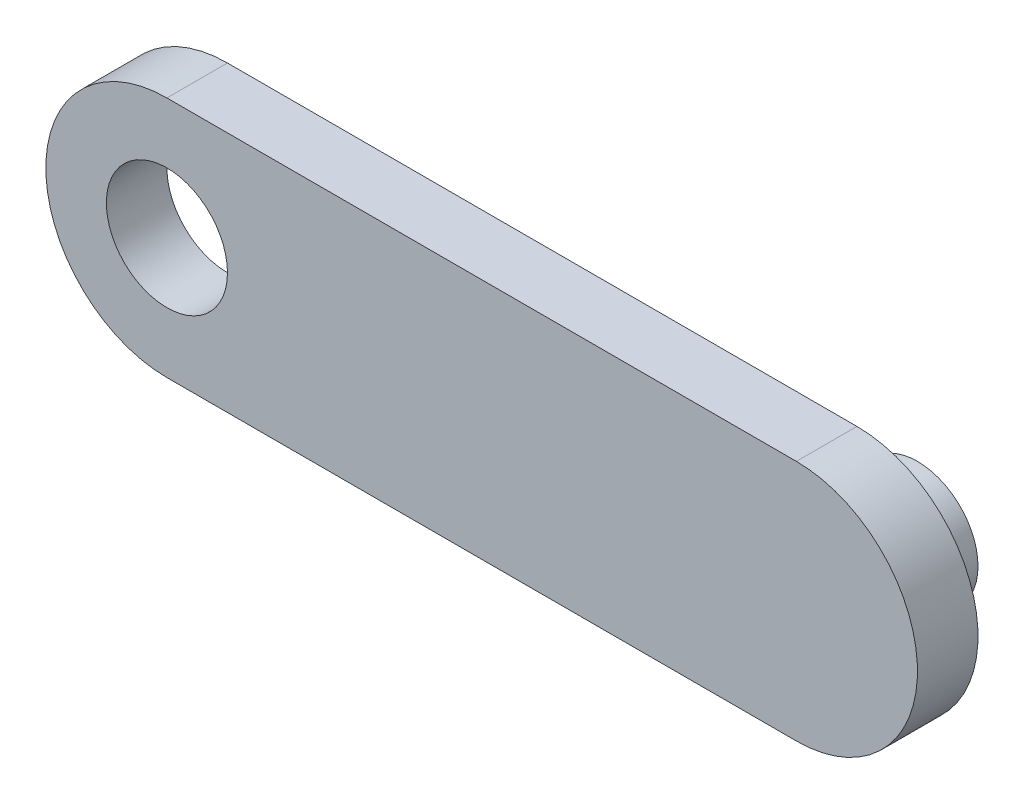
ISO-10303-21;
HEADER;
FILE_DESCRIPTION(('STEP AP214'),'2;1');
FILE_NAME('part.step','',(''),(''),'','','');
FILE_SCHEMA(('AUTOMOTIVE_DESIGN { 1 0 10303 214 1 1 1 1 }'));
ENDSEC;
DATA;
#1=APPLICATION_CONTEXT('core data for automotive mechanical design processes');
#2=APPLICATION_PROTOCOL_DEFINITION('international standard','automotive_design',2000,#1);
#3=PRODUCT_CONTEXT('',#1,'mechanical');
#4=PRODUCT('Part','Part','',(#3));
#5=PRODUCT_RELATED_PRODUCT_CATEGORY('part','',(#4));
#6=PRODUCT_DEFINITION_FORMATION('','',#4);
#7=PRODUCT_DEFINITION_CONTEXT('part definition',#1,'design');
#8=PRODUCT_DEFINITION('design','',#6,#7);
#9=PRODUCT_DEFINITION_SHAPE('','',#8);
#10=(LENGTH_UNIT() NAMED_UNIT(*) SI_UNIT(.MILLI.,.METRE.));
#11=(NAMED_UNIT(*) PLANE_ANGLE_UNIT() SI_UNIT($,.RADIAN.));
#12=(NAMED_UNIT(*) SI_UNIT($,.STERADIAN.) SOLID_ANGLE_UNIT());
#13=UNCERTAINTY_MEASURE_WITH_UNIT(LENGTH_MEASURE(1.E-05),#10,'distance_accuracy_value','');
#14=(GEOMETRIC_REPRESENTATION_CONTEXT(3) GLOBAL_UNCERTAINTY_ASSIGNED_CONTEXT((#13)) GLOBAL_UNIT_ASSIGNED_CONTEXT((#10,
#11,#12)) REPRESENTATION_CONTEXT('',''));
#15=CARTESIAN_POINT('',(0.,0.,0.));
#16=DIRECTION('',(0.,0.,1.));
#17=DIRECTION('',(1.,0.,0.));
#18=AXIS2_PLACEMENT_3D('',#15,#16,#17);
#19=CARTESIAN_POINT('',(0.,0.,10.));
#20=DIRECTION('',(0.,0.,1.));
#21=DIRECTION('',(1.,0.,0.));
#22=AXIS2_PLACEMENT_3D('',#19,#20,#21);
#23=PLANE('',#22);
#24=CARTESIAN_POINT('',(0.,0.,10.));
#25=DIRECTION('',(0.,0.,1.));
#26=DIRECTION('',(1.,0.,0.));
#27=AXIS2_PLACEMENT_3D('',#24,#25,#26);
#28=CIRCLE('',#27,20.);
#29=CARTESIAN_POINT('',(0.,20.,10.));
#30=VERTEX_POINT('',#29);
#31=CARTESIAN_POINT('',(0.,-20.,10.));
#32=VERTEX_POINT('',#31);
#33=EDGE_CURVE('E86',#30,#32,#28,.T.);
#34=ORIENTED_EDGE('',*,*,#33,.T.);
#35=DIRECTION('',(1.,0.,0.));
#36=VECTOR('',#35,1.);
#37=CARTESIAN_POINT('',(0.,-20.,10.));
#38=LINE('',#37,#36);
#39=CARTESIAN_POINT('',(103.959759811176,-20.,10.));
#40=VERTEX_POINT('',#39);
#41=EDGE_CURVE('E81',#32,#40,#38,.T.);
#42=ORIENTED_EDGE('',*,*,#41,.T.);
#43=CARTESIAN_POINT('',(103.959759811176,0.,10.));
#44=DIRECTION('',(0.,0.,1.));
#45=DIRECTION('',(1.,0.,0.));
#46=AXIS2_PLACEMENT_3D('',#43,#44,#45);
#47=CIRCLE('',#46,20.);
#48=CARTESIAN_POINT('',(103.959759811176,20.,10.));
#49=VERTEX_POINT('',#48);
#50=EDGE_CURVE('E84',#40,#49,#47,.T.);
#51=ORIENTED_EDGE('',*,*,#50,.T.);
#52=DIRECTION('',(-1.,0.,0.));
#53=VECTOR('',#52,1.);
#54=CARTESIAN_POINT('',(0.,20.,10.));
#55=LINE('',#54,#53);
#56=EDGE_CURVE('E50',#49,#30,#55,.T.);
#57=ORIENTED_EDGE('',*,*,#56,.T.);
#58=EDGE_LOOP('',(#34,#42,#51,#57));
#59=FACE_BOUND('',#58,.T.);
#60=CARTESIAN_POINT('',(0.,0.,10.));
#61=DIRECTION('',(0.,0.,1.));
#62=DIRECTION('',(1.,0.,0.));
#63=AXIS2_PLACEMENT_3D('',#60,#61,#62);
#64=CIRCLE('',#63,10.);
#65=CARTESIAN_POINT('',(10.,0.,10.));
#66=VERTEX_POINT('',#65);
#67=EDGE_CURVE('E103',#66,#66,#64,.T.);
#68=ORIENTED_EDGE('',*,*,#67,.F.);
#69=EDGE_LOOP('',(#68));
#70=FACE_BOUND('',#69,.T.);
#71=ADVANCED_FACE('F33',(#59,#70),#23,.T.);
#72=CARTESIAN_POINT('',(0.,0.,0.));
#73=DIRECTION('',(0.,0.,1.));
#74=DIRECTION('',(1.,0.,0.));
#75=AXIS2_PLACEMENT_3D('',#72,#73,#74);
#76=PLANE('',#75);
#77=CARTESIAN_POINT('',(103.959759811176,0.,0.));
#78=DIRECTION('',(0.,0.,1.));
#79=DIRECTION('',(1.,0.,0.));
#80=AXIS2_PLACEMENT_3D('',#77,#78,#79);
#81=CIRCLE('',#80,9.99999999999999);
#82=CARTESIAN_POINT('',(113.959759811176,0.,0.));
#83=VERTEX_POINT('',#82);
#84=EDGE_CURVE('E11',#83,#83,#81,.F.);
#85=ORIENTED_EDGE('',*,*,#84,.F.);
#86=EDGE_LOOP('',(#85));
#87=FACE_BOUND('',#86,.T.);
#88=CARTESIAN_POINT('',(0.,0.,0.));
#89=DIRECTION('',(0.,0.,1.));
#90=DIRECTION('',(1.,0.,0.));
#91=AXIS2_PLACEMENT_3D('',#88,#89,#90);
#92=CIRCLE('',#91,20.);
#93=CARTESIAN_POINT('',(0.,20.,0.));
#94=VERTEX_POINT('',#93);
#95=CARTESIAN_POINT('',(0.,-20.,0.));
#96=VERTEX_POINT('',#95);
#97=EDGE_CURVE('E100',#94,#96,#92,.T.);
#98=ORIENTED_EDGE('',*,*,#97,.F.);
#99=DIRECTION('',(-1.,0.,0.));
#100=VECTOR('',#99,1.);
#101=CARTESIAN_POINT('',(0.,20.,0.));
#102=LINE('',#101,#100);
#103=CARTESIAN_POINT('',(103.959759811176,20.,0.));
#104=VERTEX_POINT('',#103);
#105=EDGE_CURVE('E73',#104,#94,#102,.T.);
#106=ORIENTED_EDGE('',*,*,#105,.F.);
#107=CARTESIAN_POINT('',(103.959759811176,0.,0.));
#108=DIRECTION('',(0.,0.,1.));
#109=DIRECTION('',(1.,0.,0.));
#110=AXIS2_PLACEMENT_3D('',#107,#108,#109);
#111=CIRCLE('',#110,20.);
#112=CARTESIAN_POINT('',(103.959759811176,-20.,0.));
#113=VERTEX_POINT('',#112);
#114=EDGE_CURVE('E67',#113,#104,#111,.T.);
#115=ORIENTED_EDGE('',*,*,#114,.F.);
#116=DIRECTION('',(1.,0.,0.));
#117=VECTOR('',#116,1.);
#118=CARTESIAN_POINT('',(0.,-20.,0.));
#119=LINE('',#118,#117);
#120=EDGE_CURVE('E91',#96,#113,#119,.T.);
#121=ORIENTED_EDGE('',*,*,#120,.F.);
#122=EDGE_LOOP('',(#98,#106,#115,#121));
#123=FACE_BOUND('',#122,.T.);
#124=CARTESIAN_POINT('',(0.,0.,0.));
#125=DIRECTION('',(0.,0.,1.));
#126=DIRECTION('',(1.,0.,0.));
#127=AXIS2_PLACEMENT_3D('',#124,#125,#126);
#128=CIRCLE('',#127,10.);
#129=CARTESIAN_POINT('',(10.,0.,0.));
#130=VERTEX_POINT('',#129);
#131=EDGE_CURVE('E118',#130,#130,#128,.T.);
#132=ORIENTED_EDGE('',*,*,#131,.T.);
#133=EDGE_LOOP('',(#132));
#134=FACE_BOUND('',#133,.T.);
#135=ADVANCED_FACE('F111',(#87,#123,#134),#76,.F.);
#136=CARTESIAN_POINT('',(0.,0.,10.));
#137=DIRECTION('',(0.,0.,-1.));
#138=DIRECTION('',(-1.,0.,0.));
#139=AXIS2_PLACEMENT_3D('',#136,#137,#138);
#140=CYLINDRICAL_SURFACE('',#139,20.);
#141=ORIENTED_EDGE('',*,*,#97,.T.);
#142=DIRECTION('',(0.,0.,-1.));
#143=VECTOR('',#142,1.);
#144=CARTESIAN_POINT('',(0.,-20.,10.));
#145=LINE('',#144,#143);
#146=EDGE_CURVE('E42',#32,#96,#145,.T.);
#147=ORIENTED_EDGE('',*,*,#146,.F.);
#148=ORIENTED_EDGE('',*,*,#33,.F.);
#149=DIRECTION('',(0.,0.,-1.));
#150=VECTOR('',#149,1.);
#151=CARTESIAN_POINT('',(0.,20.,10.));
#152=LINE('',#151,#150);
#153=EDGE_CURVE('E96',#30,#94,#152,.T.);
#154=ORIENTED_EDGE('',*,*,#153,.T.);
#155=EDGE_LOOP('',(#141,#147,#148,#154));
#156=FACE_BOUND('',#155,.T.);
#157=ADVANCED_FACE('F35',(#156),#140,.T.);
#158=CARTESIAN_POINT('',(0.,-20.,10.));
#159=DIRECTION('',(0.,1.,0.));
#160=DIRECTION('',(0.,0.,1.));
#161=AXIS2_PLACEMENT_3D('',#158,#159,#160);
#162=PLANE('',#161);
#163=ORIENTED_EDGE('',*,*,#120,.T.);
#164=DIRECTION('',(0.,0.,-1.));
#165=VECTOR('',#164,1.);
#166=CARTESIAN_POINT('',(103.959759811176,-20.,10.));
#167=LINE('',#166,#165);
#168=EDGE_CURVE('E89',#40,#113,#167,.T.);
#169=ORIENTED_EDGE('',*,*,#168,.F.);
#170=ORIENTED_EDGE('',*,*,#41,.F.);
#171=ORIENTED_EDGE('',*,*,#146,.T.);
#172=EDGE_LOOP('',(#163,#169,#170,#171));
#173=FACE_BOUND('',#172,.T.);
#174=ADVANCED_FACE('F90',(#173),#162,.F.);
#175=CARTESIAN_POINT('',(103.959759811176,0.,10.));
#176=DIRECTION('',(0.,0.,-1.));
#177=DIRECTION('',(-1.,0.,0.));
#178=AXIS2_PLACEMENT_3D('',#175,#176,#177);
#179=CYLINDRICAL_SURFACE('',#178,20.);
#180=ORIENTED_EDGE('',*,*,#114,.T.);
#181=DIRECTION('',(0.,0.,-1.));
#182=VECTOR('',#181,1.);
#183=CARTESIAN_POINT('',(103.959759811176,20.,10.));
#184=LINE('',#183,#182);
#185=EDGE_CURVE('E92',#49,#104,#184,.T.);
#186=ORIENTED_EDGE('',*,*,#185,.F.);
#187=ORIENTED_EDGE('',*,*,#50,.F.);
#188=ORIENTED_EDGE('',*,*,#168,.T.);
#189=EDGE_LOOP('',(#180,#186,#187,#188));
#190=FACE_BOUND('',#189,.T.);
#191=ADVANCED_FACE('F94',(#190),#179,.T.);
#192=CARTESIAN_POINT('',(0.,20.,10.));
#193=DIRECTION('',(0.,-1.,0.));
#194=DIRECTION('',(0.,0.,-1.));
#195=AXIS2_PLACEMENT_3D('',#192,#193,#194);
#196=PLANE('',#195);
#197=ORIENTED_EDGE('',*,*,#105,.T.);
#198=ORIENTED_EDGE('',*,*,#153,.F.);
#199=ORIENTED_EDGE('',*,*,#56,.F.);
#200=ORIENTED_EDGE('',*,*,#185,.T.);
#201=EDGE_LOOP('',(#197,#198,#199,#200));
#202=FACE_BOUND('',#201,.T.);
#203=ADVANCED_FACE('F141',(#202),#196,.F.);
#204=CARTESIAN_POINT('',(0.,0.,10.));
#205=DIRECTION('',(0.,0.,-1.));
#206=DIRECTION('',(-1.,0.,0.));
#207=AXIS2_PLACEMENT_3D('',#204,#205,#206);
#208=CYLINDRICAL_SURFACE('',#207,10.);
#209=ORIENTED_EDGE('',*,*,#67,.T.);
#210=EDGE_LOOP('',(#209));
#211=FACE_BOUND('',#210,.T.);
#212=ORIENTED_EDGE('',*,*,#131,.F.);
#213=EDGE_LOOP('',(#212));
#214=FACE_BOUND('',#213,.T.);
#215=ADVANCED_FACE('F133',(#211,#214),#208,.F.);
#216=CARTESIAN_POINT('',(103.959759811176,0.,-10.));
#217=DIRECTION('',(0.,0.,1.));
#218=DIRECTION('',(1.,0.,0.));
#219=AXIS2_PLACEMENT_3D('',#216,#217,#218);
#220=CYLINDRICAL_SURFACE('',#219,9.99999999999999);
#221=CARTESIAN_POINT('',(103.959759811176,0.,-10.));
#222=DIRECTION('',(0.,0.,-1.));
#223=DIRECTION('',(-1.,0.,0.));
#224=AXIS2_PLACEMENT_3D('',#221,#222,#223);
#225=CIRCLE('',#224,9.99999999999999);
#226=CARTESIAN_POINT('',(93.9597598111759,0.,-10.));
#227=VERTEX_POINT('',#226);
#228=EDGE_CURVE('E120',#227,#227,#225,.T.);
#229=ORIENTED_EDGE('',*,*,#228,.F.);
#230=EDGE_LOOP('',(#229));
#231=FACE_BOUND('',#230,.T.);
#232=ORIENTED_EDGE('',*,*,#84,.T.);
#233=EDGE_LOOP('',(#232));
#234=FACE_BOUND('',#233,.T.);
#235=ADVANCED_FACE('F130',(#231,#234),#220,.T.);
#236=CARTESIAN_POINT('',(103.959759811176,0.,-10.));
#237=DIRECTION('',(0.,0.,-1.));
#238=DIRECTION('',(-1.,0.,0.));
#239=AXIS2_PLACEMENT_3D('',#236,#237,#238);
#240=PLANE('',#239);
#241=ORIENTED_EDGE('',*,*,#228,.T.);
#242=EDGE_LOOP('',(#241));
#243=FACE_BOUND('',#242,.T.);
#244=ADVANCED_FACE('F128',(#243),#240,.T.);
#245=CLOSED_SHELL('',(#71,#135,#157,#174,#191,#203,#215,#235,#244));
#246=MANIFOLD_SOLID_BREP('B2',#245);
#247=ADVANCED_BREP_SHAPE_REPRESENTATION('',(#18,#246),#14);
#248=SHAPE_DEFINITION_REPRESENTATION(#9,#247);
ENDSEC;
END-ISO-10303-21;
